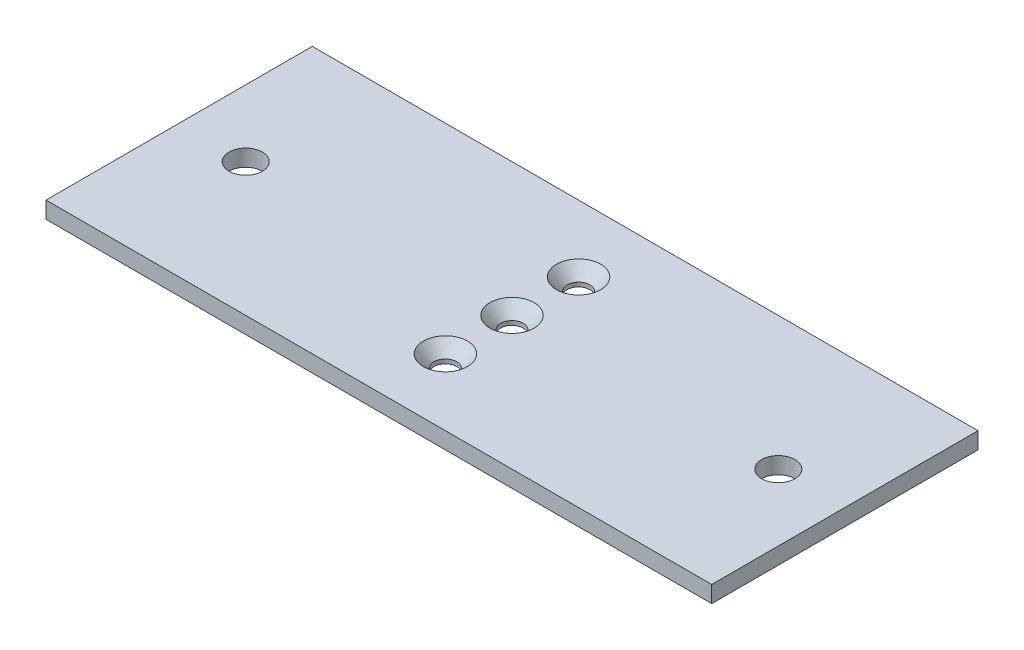
ISO-10303-21;
HEADER;
FILE_DESCRIPTION(('STEP AP214'),'2;1');
FILE_NAME('part.step','',(''),(''),'','','');
FILE_SCHEMA(('AUTOMOTIVE_DESIGN { 1 0 10303 214 1 1 1 1 }'));
ENDSEC;
DATA;
#1=APPLICATION_CONTEXT('core data for automotive mechanical design processes');
#2=APPLICATION_PROTOCOL_DEFINITION('international standard','automotive_design',2000,#1);
#3=PRODUCT_CONTEXT('',#1,'mechanical');
#4=PRODUCT('Part','Part','',(#3));
#5=PRODUCT_RELATED_PRODUCT_CATEGORY('part','',(#4));
#6=PRODUCT_DEFINITION_FORMATION('','',#4);
#7=PRODUCT_DEFINITION_CONTEXT('part definition',#1,'design');
#8=PRODUCT_DEFINITION('design','',#6,#7);
#9=PRODUCT_DEFINITION_SHAPE('','',#8);
#10=(LENGTH_UNIT() NAMED_UNIT(*) SI_UNIT(.MILLI.,.METRE.));
#11=(NAMED_UNIT(*) PLANE_ANGLE_UNIT() SI_UNIT($,.RADIAN.));
#12=(NAMED_UNIT(*) SI_UNIT($,.STERADIAN.) SOLID_ANGLE_UNIT());
#13=UNCERTAINTY_MEASURE_WITH_UNIT(LENGTH_MEASURE(1.E-05),#10,'distance_accuracy_value','');
#14=(GEOMETRIC_REPRESENTATION_CONTEXT(3) GLOBAL_UNCERTAINTY_ASSIGNED_CONTEXT((#13)) GLOBAL_UNIT_ASSIGNED_CONTEXT((#10,
#11,#12)) REPRESENTATION_CONTEXT('',''));
#15=CARTESIAN_POINT('',(0.,0.,0.));
#16=DIRECTION('',(0.,0.,1.));
#17=DIRECTION('',(1.,0.,0.));
#18=AXIS2_PLACEMENT_3D('',#15,#16,#17);
#19=CARTESIAN_POINT('',(0.,3.175,0.));
#20=DIRECTION('',(1.,0.,0.));
#21=DIRECTION('',(0.,0.,-1.));
#22=AXIS2_PLACEMENT_3D('',#19,#20,#21);
#23=PLANE('',#22);
#24=DIRECTION('',(0.,0.,1.));
#25=VECTOR('',#24,1.);
#26=CARTESIAN_POINT('',(0.,0.,0.));
#27=LINE('',#26,#25);
#28=CARTESIAN_POINT('',(0.,0.,-50.8));
#29=VERTEX_POINT('',#28);
#30=CARTESIAN_POINT('',(0.,0.,0.));
#31=VERTEX_POINT('',#30);
#32=EDGE_CURVE('E98',#29,#31,#27,.T.);
#33=ORIENTED_EDGE('',*,*,#32,.T.);
#34=DIRECTION('',(0.,-1.,0.));
#35=VECTOR('',#34,1.);
#36=CARTESIAN_POINT('',(0.,3.175,0.));
#37=LINE('',#36,#35);
#38=CARTESIAN_POINT('',(0.,3.175,0.));
#39=VERTEX_POINT('',#38);
#40=EDGE_CURVE('E11',#39,#31,#37,.T.);
#41=ORIENTED_EDGE('',*,*,#40,.F.);
#42=DIRECTION('',(0.,0.,1.));
#43=VECTOR('',#42,1.);
#44=CARTESIAN_POINT('',(0.,3.175,0.));
#45=LINE('',#44,#43);
#46=CARTESIAN_POINT('',(0.,3.175,-50.8));
#47=VERTEX_POINT('',#46);
#48=EDGE_CURVE('E85',#47,#39,#45,.T.);
#49=ORIENTED_EDGE('',*,*,#48,.F.);
#50=DIRECTION('',(0.,-1.,0.));
#51=VECTOR('',#50,1.);
#52=CARTESIAN_POINT('',(0.,3.175,-50.8));
#53=LINE('',#52,#51);
#54=EDGE_CURVE('E94',#47,#29,#53,.T.);
#55=ORIENTED_EDGE('',*,*,#54,.T.);
#56=EDGE_LOOP('',(#33,#41,#49,#55));
#57=FACE_BOUND('',#56,.T.);
#58=ADVANCED_FACE('F32',(#57),#23,.F.);
#59=CARTESIAN_POINT('',(0.,3.175,0.));
#60=DIRECTION('',(0.,0.,-1.));
#61=DIRECTION('',(-1.,0.,0.));
#62=AXIS2_PLACEMENT_3D('',#59,#60,#61);
#63=PLANE('',#62);
#64=DIRECTION('',(1.,0.,0.));
#65=VECTOR('',#64,1.);
#66=CARTESIAN_POINT('',(0.,0.,0.));
#67=LINE('',#66,#65);
#68=CARTESIAN_POINT('',(127.,0.,0.));
#69=VERTEX_POINT('',#68);
#70=EDGE_CURVE('E89',#31,#69,#67,.T.);
#71=ORIENTED_EDGE('',*,*,#70,.T.);
#72=DIRECTION('',(0.,-1.,0.));
#73=VECTOR('',#72,1.);
#74=CARTESIAN_POINT('',(127.,3.175,0.));
#75=LINE('',#74,#73);
#76=CARTESIAN_POINT('',(127.,3.175,0.));
#77=VERTEX_POINT('',#76);
#78=EDGE_CURVE('E41',#77,#69,#75,.T.);
#79=ORIENTED_EDGE('',*,*,#78,.F.);
#80=DIRECTION('',(1.,0.,0.));
#81=VECTOR('',#80,1.);
#82=CARTESIAN_POINT('',(0.,3.175,0.));
#83=LINE('',#82,#81);
#84=EDGE_CURVE('E80',#39,#77,#83,.T.);
#85=ORIENTED_EDGE('',*,*,#84,.F.);
#86=ORIENTED_EDGE('',*,*,#40,.T.);
#87=EDGE_LOOP('',(#71,#79,#85,#86));
#88=FACE_BOUND('',#87,.T.);
#89=ADVANCED_FACE('F88',(#88),#63,.F.);
#90=CARTESIAN_POINT('',(127.,3.175,0.));
#91=DIRECTION('',(-1.,0.,0.));
#92=DIRECTION('',(0.,0.,1.));
#93=AXIS2_PLACEMENT_3D('',#90,#91,#92);
#94=PLANE('',#93);
#95=DIRECTION('',(0.,0.,-1.));
#96=VECTOR('',#95,1.);
#97=CARTESIAN_POINT('',(127.,0.,0.));
#98=LINE('',#97,#96);
#99=CARTESIAN_POINT('',(127.,0.,-50.8));
#100=VERTEX_POINT('',#99);
#101=EDGE_CURVE('E67',#69,#100,#98,.T.);
#102=ORIENTED_EDGE('',*,*,#101,.T.);
#103=DIRECTION('',(0.,-1.,0.));
#104=VECTOR('',#103,1.);
#105=CARTESIAN_POINT('',(127.,3.175,-50.8));
#106=LINE('',#105,#104);
#107=CARTESIAN_POINT('',(127.,3.175,-50.8));
#108=VERTEX_POINT('',#107);
#109=EDGE_CURVE('E90',#108,#100,#106,.T.);
#110=ORIENTED_EDGE('',*,*,#109,.F.);
#111=DIRECTION('',(0.,0.,-1.));
#112=VECTOR('',#111,1.);
#113=CARTESIAN_POINT('',(127.,3.175,0.));
#114=LINE('',#113,#112);
#115=EDGE_CURVE('E83',#77,#108,#114,.T.);
#116=ORIENTED_EDGE('',*,*,#115,.F.);
#117=ORIENTED_EDGE('',*,*,#78,.T.);
#118=EDGE_LOOP('',(#102,#110,#116,#117));
#119=FACE_BOUND('',#118,.T.);
#120=ADVANCED_FACE('F92',(#119),#94,.F.);
#121=CARTESIAN_POINT('',(0.,3.175,-50.8));
#122=DIRECTION('',(0.,0.,1.));
#123=DIRECTION('',(1.,0.,0.));
#124=AXIS2_PLACEMENT_3D('',#121,#122,#123);
#125=PLANE('',#124);
#126=DIRECTION('',(-1.,0.,0.));
#127=VECTOR('',#126,1.);
#128=CARTESIAN_POINT('',(0.,0.,-50.8));
#129=LINE('',#128,#127);
#130=EDGE_CURVE('E73',#100,#29,#129,.T.);
#131=ORIENTED_EDGE('',*,*,#130,.T.);
#132=ORIENTED_EDGE('',*,*,#54,.F.);
#133=DIRECTION('',(-1.,0.,0.));
#134=VECTOR('',#133,1.);
#135=CARTESIAN_POINT('',(0.,3.175,-50.8));
#136=LINE('',#135,#134);
#137=EDGE_CURVE('E50',#108,#47,#136,.T.);
#138=ORIENTED_EDGE('',*,*,#137,.F.);
#139=ORIENTED_EDGE('',*,*,#109,.T.);
#140=EDGE_LOOP('',(#131,#132,#138,#139));
#141=FACE_BOUND('',#140,.T.);
#142=ADVANCED_FACE('F152',(#141),#125,.F.);
#143=CARTESIAN_POINT('',(0.,3.175,0.));
#144=DIRECTION('',(0.,-1.,0.));
#145=DIRECTION('',(0.,0.,-1.));
#146=AXIS2_PLACEMENT_3D('',#143,#144,#145);
#147=PLANE('',#146);
#148=CARTESIAN_POINT('',(63.5,3.175,-12.7));
#149=DIRECTION('',(0.,1.,0.));
#150=DIRECTION('',(0.,0.,1.));
#151=AXIS2_PLACEMENT_3D('',#148,#149,#150);
#152=CIRCLE('',#151,4.21639999999999);
#153=CARTESIAN_POINT('',(63.5,3.175,-8.48360000000001));
#154=VERTEX_POINT('',#153);
#155=EDGE_CURVE('E143',#154,#154,#152,.T.);
#156=ORIENTED_EDGE('',*,*,#155,.F.);
#157=EDGE_LOOP('',(#156));
#158=FACE_BOUND('',#157,.T.);
#159=CARTESIAN_POINT('',(63.5,3.175,-25.4));
#160=DIRECTION('',(0.,1.,0.));
#161=DIRECTION('',(0.,0.,1.));
#162=AXIS2_PLACEMENT_3D('',#159,#160,#161);
#163=CIRCLE('',#162,4.21639999999999);
#164=CARTESIAN_POINT('',(63.5,3.175,-21.1836));
#165=VERTEX_POINT('',#164);
#166=EDGE_CURVE('E134',#165,#165,#163,.T.);
#167=ORIENTED_EDGE('',*,*,#166,.F.);
#168=EDGE_LOOP('',(#167));
#169=FACE_BOUND('',#168,.T.);
#170=CARTESIAN_POINT('',(63.5,3.175,-38.1));
#171=DIRECTION('',(0.,1.,0.));
#172=DIRECTION('',(0.,0.,1.));
#173=AXIS2_PLACEMENT_3D('',#170,#171,#172);
#174=CIRCLE('',#173,4.21639999999999);
#175=CARTESIAN_POINT('',(63.5,3.175,-33.8836));
#176=VERTEX_POINT('',#175);
#177=EDGE_CURVE('E125',#176,#176,#174,.T.);
#178=ORIENTED_EDGE('',*,*,#177,.F.);
#179=EDGE_LOOP('',(#178));
#180=FACE_BOUND('',#179,.T.);
#181=CARTESIAN_POINT('',(114.3,3.175,-25.4));
#182=DIRECTION('',(0.,1.,0.));
#183=DIRECTION('',(0.,0.,1.));
#184=AXIS2_PLACEMENT_3D('',#181,#182,#183);
#185=CIRCLE('',#184,3.175);
#186=CARTESIAN_POINT('',(114.3,3.175,-22.225));
#187=VERTEX_POINT('',#186);
#188=EDGE_CURVE('E115',#187,#187,#185,.T.);
#189=ORIENTED_EDGE('',*,*,#188,.F.);
#190=EDGE_LOOP('',(#189));
#191=FACE_BOUND('',#190,.T.);
#192=CARTESIAN_POINT('',(12.7,3.175,-25.4));
#193=DIRECTION('',(0.,1.,0.));
#194=DIRECTION('',(0.,0.,1.));
#195=AXIS2_PLACEMENT_3D('',#192,#193,#194);
#196=CIRCLE('',#195,3.175);
#197=CARTESIAN_POINT('',(12.7,3.175,-22.225));
#198=VERTEX_POINT('',#197);
#199=EDGE_CURVE('E107',#198,#198,#196,.T.);
#200=ORIENTED_EDGE('',*,*,#199,.F.);
#201=EDGE_LOOP('',(#200));
#202=FACE_BOUND('',#201,.T.);
#203=ORIENTED_EDGE('',*,*,#48,.T.);
#204=ORIENTED_EDGE('',*,*,#84,.T.);
#205=ORIENTED_EDGE('',*,*,#115,.T.);
#206=ORIENTED_EDGE('',*,*,#137,.T.);
#207=EDGE_LOOP('',(#203,#204,#205,#206));
#208=FACE_BOUND('',#207,.T.);
#209=ADVANCED_FACE('F81',(#158,#169,#180,#191,#202,#208),#147,.F.);
#210=CARTESIAN_POINT('',(0.,0.,0.));
#211=DIRECTION('',(0.,-1.,0.));
#212=DIRECTION('',(0.,0.,-1.));
#213=AXIS2_PLACEMENT_3D('',#210,#211,#212);
#214=PLANE('',#213);
#215=CARTESIAN_POINT('',(63.5,0.,-12.7));
#216=DIRECTION('',(0.,1.,0.));
#217=DIRECTION('',(0.,0.,1.));
#218=AXIS2_PLACEMENT_3D('',#215,#216,#217);
#219=CIRCLE('',#218,2.15265000000001);
#220=CARTESIAN_POINT('',(63.5,0.,-10.54735));
#221=VERTEX_POINT('',#220);
#222=EDGE_CURVE('E137',#221,#221,#219,.T.);
#223=ORIENTED_EDGE('',*,*,#222,.T.);
#224=EDGE_LOOP('',(#223));
#225=FACE_BOUND('',#224,.T.);
#226=CARTESIAN_POINT('',(63.5,0.,-25.4));
#227=DIRECTION('',(0.,1.,0.));
#228=DIRECTION('',(0.,0.,1.));
#229=AXIS2_PLACEMENT_3D('',#226,#227,#228);
#230=CIRCLE('',#229,2.15265000000001);
#231=CARTESIAN_POINT('',(63.5,0.,-23.24735));
#232=VERTEX_POINT('',#231);
#233=EDGE_CURVE('E128',#232,#232,#230,.T.);
#234=ORIENTED_EDGE('',*,*,#233,.T.);
#235=EDGE_LOOP('',(#234));
#236=FACE_BOUND('',#235,.T.);
#237=CARTESIAN_POINT('',(63.5,0.,-38.1));
#238=DIRECTION('',(0.,1.,0.));
#239=DIRECTION('',(0.,0.,1.));
#240=AXIS2_PLACEMENT_3D('',#237,#238,#239);
#241=CIRCLE('',#240,2.15265000000001);
#242=CARTESIAN_POINT('',(63.5,0.,-35.94735));
#243=VERTEX_POINT('',#242);
#244=EDGE_CURVE('E119',#243,#243,#241,.T.);
#245=ORIENTED_EDGE('',*,*,#244,.T.);
#246=EDGE_LOOP('',(#245));
#247=FACE_BOUND('',#246,.T.);
#248=CARTESIAN_POINT('',(114.3,0.,-25.4));
#249=DIRECTION('',(0.,-1.,0.));
#250=DIRECTION('',(0.,0.,-1.));
#251=AXIS2_PLACEMENT_3D('',#248,#249,#250);
#252=CIRCLE('',#251,3.175);
#253=CARTESIAN_POINT('',(114.3,0.,-28.575));
#254=VERTEX_POINT('',#253);
#255=EDGE_CURVE('E35',#254,#254,#252,.T.);
#256=ORIENTED_EDGE('',*,*,#255,.F.);
#257=EDGE_LOOP('',(#256));
#258=FACE_BOUND('',#257,.T.);
#259=CARTESIAN_POINT('',(12.7,0.,-25.4));
#260=DIRECTION('',(0.,-1.,0.));
#261=DIRECTION('',(0.,0.,-1.));
#262=AXIS2_PLACEMENT_3D('',#259,#260,#261);
#263=CIRCLE('',#262,3.175);
#264=CARTESIAN_POINT('',(12.7,0.,-28.575));
#265=VERTEX_POINT('',#264);
#266=EDGE_CURVE('E101',#265,#265,#263,.T.);
#267=ORIENTED_EDGE('',*,*,#266,.F.);
#268=EDGE_LOOP('',(#267));
#269=FACE_BOUND('',#268,.T.);
#270=ORIENTED_EDGE('',*,*,#32,.F.);
#271=ORIENTED_EDGE('',*,*,#130,.F.);
#272=ORIENTED_EDGE('',*,*,#101,.F.);
#273=ORIENTED_EDGE('',*,*,#70,.F.);
#274=EDGE_LOOP('',(#270,#271,#272,#273));
#275=FACE_BOUND('',#274,.T.);
#276=ADVANCED_FACE('F151',(#225,#236,#247,#258,#269,#275),#214,.T.);
#277=CARTESIAN_POINT('',(12.7,-3.175,-25.4));
#278=DIRECTION('',(0.,1.,0.));
#279=DIRECTION('',(0.,0.,1.));
#280=AXIS2_PLACEMENT_3D('',#277,#278,#279);
#281=CYLINDRICAL_SURFACE('',#280,3.175);
#282=ORIENTED_EDGE('',*,*,#266,.T.);
#283=EDGE_LOOP('',(#282));
#284=FACE_BOUND('',#283,.T.);
#285=ORIENTED_EDGE('',*,*,#199,.T.);
#286=EDGE_LOOP('',(#285));
#287=FACE_BOUND('',#286,.T.);
#288=ADVANCED_FACE('F164',(#284,#287),#281,.F.);
#289=CARTESIAN_POINT('',(114.3,-3.175,-25.4));
#290=DIRECTION('',(0.,1.,0.));
#291=DIRECTION('',(0.,0.,1.));
#292=AXIS2_PLACEMENT_3D('',#289,#290,#291);
#293=CYLINDRICAL_SURFACE('',#292,3.175);
#294=ORIENTED_EDGE('',*,*,#255,.T.);
#295=EDGE_LOOP('',(#294));
#296=FACE_BOUND('',#295,.T.);
#297=ORIENTED_EDGE('',*,*,#188,.T.);
#298=EDGE_LOOP('',(#297));
#299=FACE_BOUND('',#298,.T.);
#300=ADVANCED_FACE('F161',(#296,#299),#293,.F.);
#301=CARTESIAN_POINT('',(63.5,3.175,-38.1));
#302=DIRECTION('',(0.,1.,0.));
#303=DIRECTION('',(0.,0.,1.));
#304=AXIS2_PLACEMENT_3D('',#301,#302,#303);
#305=CYLINDRICAL_SURFACE('',#304,2.15265000000001);
#306=ORIENTED_EDGE('',*,*,#244,.F.);
#307=EDGE_LOOP('',(#306));
#308=FACE_BOUND('',#307,.T.);
#309=CARTESIAN_POINT('',(63.5,0.800927199597641,-38.1));
#310=DIRECTION('',(0.,1.,0.));
#311=DIRECTION('',(0.,0.,1.));
#312=AXIS2_PLACEMENT_3D('',#309,#310,#311);
#313=CIRCLE('',#312,2.15265000000001);
#314=CARTESIAN_POINT('',(63.5,0.800927199597641,-35.94735));
#315=VERTEX_POINT('',#314);
#316=EDGE_CURVE('E122',#315,#315,#313,.T.);
#317=ORIENTED_EDGE('',*,*,#316,.T.);
#318=EDGE_LOOP('',(#317));
#319=FACE_BOUND('',#318,.T.);
#320=ADVANCED_FACE('F163',(#308,#319),#305,.F.);
#321=CARTESIAN_POINT('',(63.5,3.175,-38.1));
#322=DIRECTION('',(0.,1.,0.));
#323=DIRECTION('',(0.,0.,1.));
#324=AXIS2_PLACEMENT_3D('',#321,#322,#323);
#325=CONICAL_SURFACE('',#324,4.21639999999999,0.715584993317672);
#326=ORIENTED_EDGE('',*,*,#316,.F.);
#327=EDGE_LOOP('',(#326));
#328=FACE_BOUND('',#327,.T.);
#329=ORIENTED_EDGE('',*,*,#177,.T.);
#330=EDGE_LOOP('',(#329));
#331=FACE_BOUND('',#330,.T.);
#332=ADVANCED_FACE('F171',(#328,#331),#325,.F.);
#333=CARTESIAN_POINT('',(63.5,3.175,-25.4));
#334=DIRECTION('',(0.,1.,0.));
#335=DIRECTION('',(0.,0.,1.));
#336=AXIS2_PLACEMENT_3D('',#333,#334,#335);
#337=CYLINDRICAL_SURFACE('',#336,2.15265000000001);
#338=ORIENTED_EDGE('',*,*,#233,.F.);
#339=EDGE_LOOP('',(#338));
#340=FACE_BOUND('',#339,.T.);
#341=CARTESIAN_POINT('',(63.5,0.800927199597641,-25.4));
#342=DIRECTION('',(0.,1.,0.));
#343=DIRECTION('',(0.,0.,1.));
#344=AXIS2_PLACEMENT_3D('',#341,#342,#343);
#345=CIRCLE('',#344,2.15265000000001);
#346=CARTESIAN_POINT('',(63.5,0.800927199597641,-23.24735));
#347=VERTEX_POINT('',#346);
#348=EDGE_CURVE('E131',#347,#347,#345,.T.);
#349=ORIENTED_EDGE('',*,*,#348,.T.);
#350=EDGE_LOOP('',(#349));
#351=FACE_BOUND('',#350,.T.);
#352=ADVANCED_FACE('F227',(#340,#351),#337,.F.);
#353=CARTESIAN_POINT('',(63.5,3.175,-25.4));
#354=DIRECTION('',(0.,1.,0.));
#355=DIRECTION('',(0.,0.,1.));
#356=AXIS2_PLACEMENT_3D('',#353,#354,#355);
#357=CONICAL_SURFACE('',#356,4.21639999999999,0.715584993317672);
#358=ORIENTED_EDGE('',*,*,#348,.F.);
#359=EDGE_LOOP('',(#358));
#360=FACE_BOUND('',#359,.T.);
#361=ORIENTED_EDGE('',*,*,#166,.T.);
#362=EDGE_LOOP('',(#361));
#363=FACE_BOUND('',#362,.T.);
#364=ADVANCED_FACE('F237',(#360,#363),#357,.F.);
#365=CARTESIAN_POINT('',(63.5,3.175,-12.7));
#366=DIRECTION('',(0.,1.,0.));
#367=DIRECTION('',(0.,0.,1.));
#368=AXIS2_PLACEMENT_3D('',#365,#366,#367);
#369=CYLINDRICAL_SURFACE('',#368,2.15265000000001);
#370=ORIENTED_EDGE('',*,*,#222,.F.);
#371=EDGE_LOOP('',(#370));
#372=FACE_BOUND('',#371,.T.);
#373=CARTESIAN_POINT('',(63.5,0.800927199597641,-12.7));
#374=DIRECTION('',(0.,1.,0.));
#375=DIRECTION('',(0.,0.,1.));
#376=AXIS2_PLACEMENT_3D('',#373,#374,#375);
#377=CIRCLE('',#376,2.15265000000001);
#378=CARTESIAN_POINT('',(63.5,0.800927199597641,-10.54735));
#379=VERTEX_POINT('',#378);
#380=EDGE_CURVE('E140',#379,#379,#377,.T.);
#381=ORIENTED_EDGE('',*,*,#380,.T.);
#382=EDGE_LOOP('',(#381));
#383=FACE_BOUND('',#382,.T.);
#384=ADVANCED_FACE('F247',(#372,#383),#369,.F.);
#385=CARTESIAN_POINT('',(63.5,3.175,-12.7));
#386=DIRECTION('',(0.,1.,0.));
#387=DIRECTION('',(0.,0.,1.));
#388=AXIS2_PLACEMENT_3D('',#385,#386,#387);
#389=CONICAL_SURFACE('',#388,4.21639999999999,0.715584993317672);
#390=ORIENTED_EDGE('',*,*,#380,.F.);
#391=EDGE_LOOP('',(#390));
#392=FACE_BOUND('',#391,.T.);
#393=ORIENTED_EDGE('',*,*,#155,.T.);
#394=EDGE_LOOP('',(#393));
#395=FACE_BOUND('',#394,.T.);
#396=ADVANCED_FACE('F147',(#392,#395),#389,.F.);
#397=CLOSED_SHELL('',(#58,#89,#120,#142,#209,#276,#288,#300,#320,#332,#352,#364,#384,#396));
#398=MANIFOLD_SOLID_BREP('B2',#397);
#399=ADVANCED_BREP_SHAPE_REPRESENTATION('',(#18,#398),#14);
#400=SHAPE_DEFINITION_REPRESENTATION(#9,#399);
ENDSEC;
END-ISO-10303-21;
